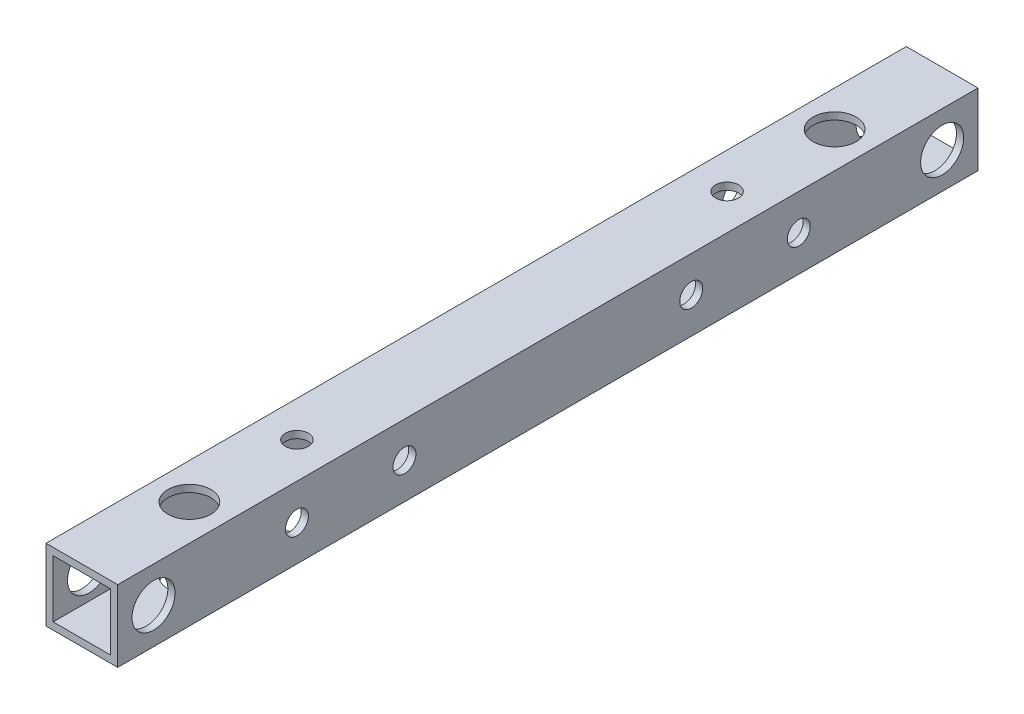
ISO-10303-21;
HEADER;
FILE_DESCRIPTION(('STEP AP214'),'2;1');
FILE_NAME('part.step','',(''),(''),'','','');
FILE_SCHEMA(('AUTOMOTIVE_DESIGN { 1 0 10303 214 1 1 1 1 }'));
ENDSEC;
DATA;
#1=APPLICATION_CONTEXT('core data for automotive mechanical design processes');
#2=APPLICATION_PROTOCOL_DEFINITION('international standard','automotive_design',2000,#1);
#3=PRODUCT_CONTEXT('',#1,'mechanical');
#4=PRODUCT('Part','Part','',(#3));
#5=PRODUCT_RELATED_PRODUCT_CATEGORY('part','',(#4));
#6=PRODUCT_DEFINITION_FORMATION('','',#4);
#7=PRODUCT_DEFINITION_CONTEXT('part definition',#1,'design');
#8=PRODUCT_DEFINITION('design','',#6,#7);
#9=PRODUCT_DEFINITION_SHAPE('','',#8);
#10=(LENGTH_UNIT() NAMED_UNIT(*) SI_UNIT(.MILLI.,.METRE.));
#11=(NAMED_UNIT(*) PLANE_ANGLE_UNIT() SI_UNIT($,.RADIAN.));
#12=(NAMED_UNIT(*) SI_UNIT($,.STERADIAN.) SOLID_ANGLE_UNIT());
#13=UNCERTAINTY_MEASURE_WITH_UNIT(LENGTH_MEASURE(1.E-05),#10,'distance_accuracy_value','');
#14=(GEOMETRIC_REPRESENTATION_CONTEXT(3) GLOBAL_UNCERTAINTY_ASSIGNED_CONTEXT((#13)) GLOBAL_UNIT_ASSIGNED_CONTEXT((#10,
#11,#12)) REPRESENTATION_CONTEXT('',''));
#15=CARTESIAN_POINT('',(0.,0.,0.));
#16=DIRECTION('',(0.,0.,1.));
#17=DIRECTION('',(1.,0.,0.));
#18=AXIS2_PLACEMENT_3D('',#15,#16,#17);
#19=CARTESIAN_POINT('',(0.,0.,120.));
#20=DIRECTION('',(0.,0.,-1.));
#21=DIRECTION('',(-1.,0.,0.));
#22=AXIS2_PLACEMENT_3D('',#19,#20,#21);
#23=PLANE('',#22);
#24=DIRECTION('',(0.,1.,0.));
#25=VECTOR('',#24,1.);
#26=CARTESIAN_POINT('',(5.,-5.,120.));
#27=LINE('',#26,#25);
#28=CARTESIAN_POINT('',(5.,-5.,120.));
#29=VERTEX_POINT('',#28);
#30=CARTESIAN_POINT('',(5.,5.,120.));
#31=VERTEX_POINT('',#30);
#32=EDGE_CURVE('E140',#29,#31,#27,.T.);
#33=ORIENTED_EDGE('',*,*,#32,.T.);
#34=DIRECTION('',(-1.,0.,0.));
#35=VECTOR('',#34,1.);
#36=CARTESIAN_POINT('',(-5.,5.,120.));
#37=LINE('',#36,#35);
#38=CARTESIAN_POINT('',(-5.,5.,120.));
#39=VERTEX_POINT('',#38);
#40=EDGE_CURVE('E143',#31,#39,#37,.T.);
#41=ORIENTED_EDGE('',*,*,#40,.T.);
#42=DIRECTION('',(0.,-1.,0.));
#43=VECTOR('',#42,1.);
#44=CARTESIAN_POINT('',(-5.,-5.,120.));
#45=LINE('',#44,#43);
#46=CARTESIAN_POINT('',(-5.,-5.,120.));
#47=VERTEX_POINT('',#46);
#48=EDGE_CURVE('E146',#39,#47,#45,.T.);
#49=ORIENTED_EDGE('',*,*,#48,.T.);
#50=DIRECTION('',(1.,0.,0.));
#51=VECTOR('',#50,1.);
#52=CARTESIAN_POINT('',(-5.,-5.,120.));
#53=LINE('',#52,#51);
#54=EDGE_CURVE('E148',#47,#29,#53,.T.);
#55=ORIENTED_EDGE('',*,*,#54,.T.);
#56=EDGE_LOOP('',(#33,#41,#49,#55));
#57=FACE_BOUND('',#56,.T.);
#58=DIRECTION('',(0.,-1.,0.));
#59=VECTOR('',#58,1.);
#60=CARTESIAN_POINT('',(-4.,-4.,120.));
#61=LINE('',#60,#59);
#62=CARTESIAN_POINT('',(-4.,4.,120.));
#63=VERTEX_POINT('',#62);
#64=CARTESIAN_POINT('',(-4.,-4.,120.));
#65=VERTEX_POINT('',#64);
#66=EDGE_CURVE('E102',#63,#65,#61,.T.);
#67=ORIENTED_EDGE('',*,*,#66,.F.);
#68=DIRECTION('',(-1.,0.,0.));
#69=VECTOR('',#68,1.);
#70=CARTESIAN_POINT('',(4.,4.,120.));
#71=LINE('',#70,#69);
#72=CARTESIAN_POINT('',(4.,4.,120.));
#73=VERTEX_POINT('',#72);
#74=EDGE_CURVE('E124',#73,#63,#71,.T.);
#75=ORIENTED_EDGE('',*,*,#74,.F.);
#76=DIRECTION('',(0.,1.,0.));
#77=VECTOR('',#76,1.);
#78=CARTESIAN_POINT('',(4.,-4.,120.));
#79=LINE('',#78,#77);
#80=CARTESIAN_POINT('',(4.,-4.,120.));
#81=VERTEX_POINT('',#80);
#82=EDGE_CURVE('E122',#81,#73,#79,.T.);
#83=ORIENTED_EDGE('',*,*,#82,.F.);
#84=DIRECTION('',(1.,0.,0.));
#85=VECTOR('',#84,1.);
#86=CARTESIAN_POINT('',(4.,-4.,120.));
#87=LINE('',#86,#85);
#88=EDGE_CURVE('E110',#65,#81,#87,.T.);
#89=ORIENTED_EDGE('',*,*,#88,.F.);
#90=EDGE_LOOP('',(#67,#75,#83,#89));
#91=FACE_BOUND('',#90,.T.);
#92=ADVANCED_FACE('F35',(#57,#91),#23,.F.);
#93=CARTESIAN_POINT('',(0.,0.,0.));
#94=DIRECTION('',(0.,0.,-1.));
#95=DIRECTION('',(-1.,0.,0.));
#96=AXIS2_PLACEMENT_3D('',#93,#94,#95);
#97=PLANE('',#96);
#98=DIRECTION('',(0.,1.,0.));
#99=VECTOR('',#98,1.);
#100=CARTESIAN_POINT('',(5.,-5.,0.));
#101=LINE('',#100,#99);
#102=CARTESIAN_POINT('',(5.,-5.,0.));
#103=VERTEX_POINT('',#102);
#104=CARTESIAN_POINT('',(5.,5.,0.));
#105=VERTEX_POINT('',#104);
#106=EDGE_CURVE('E118',#103,#105,#101,.T.);
#107=ORIENTED_EDGE('',*,*,#106,.F.);
#108=DIRECTION('',(1.,0.,0.));
#109=VECTOR('',#108,1.);
#110=CARTESIAN_POINT('',(-5.,-5.,0.));
#111=LINE('',#110,#109);
#112=CARTESIAN_POINT('',(-5.,-5.,0.));
#113=VERTEX_POINT('',#112);
#114=EDGE_CURVE('E144',#113,#103,#111,.T.);
#115=ORIENTED_EDGE('',*,*,#114,.F.);
#116=DIRECTION('',(0.,-1.,0.));
#117=VECTOR('',#116,1.);
#118=CARTESIAN_POINT('',(-5.,-5.,0.));
#119=LINE('',#118,#117);
#120=CARTESIAN_POINT('',(-5.,5.,0.));
#121=VERTEX_POINT('',#120);
#122=EDGE_CURVE('E155',#121,#113,#119,.T.);
#123=ORIENTED_EDGE('',*,*,#122,.F.);
#124=DIRECTION('',(-1.,0.,0.));
#125=VECTOR('',#124,1.);
#126=CARTESIAN_POINT('',(-5.,5.,0.));
#127=LINE('',#126,#125);
#128=EDGE_CURVE('E153',#105,#121,#127,.T.);
#129=ORIENTED_EDGE('',*,*,#128,.F.);
#130=EDGE_LOOP('',(#107,#115,#123,#129));
#131=FACE_BOUND('',#130,.T.);
#132=DIRECTION('',(-1.,0.,0.));
#133=VECTOR('',#132,1.);
#134=CARTESIAN_POINT('',(4.,4.,0.));
#135=LINE('',#134,#133);
#136=CARTESIAN_POINT('',(4.,4.,0.));
#137=VERTEX_POINT('',#136);
#138=CARTESIAN_POINT('',(-4.,4.,0.));
#139=VERTEX_POINT('',#138);
#140=EDGE_CURVE('E111',#137,#139,#135,.T.);
#141=ORIENTED_EDGE('',*,*,#140,.T.);
#142=DIRECTION('',(0.,-1.,0.));
#143=VECTOR('',#142,1.);
#144=CARTESIAN_POINT('',(-4.,-4.,0.));
#145=LINE('',#144,#143);
#146=CARTESIAN_POINT('',(-4.,-4.,0.));
#147=VERTEX_POINT('',#146);
#148=EDGE_CURVE('E60',#139,#147,#145,.T.);
#149=ORIENTED_EDGE('',*,*,#148,.T.);
#150=DIRECTION('',(1.,0.,0.));
#151=VECTOR('',#150,1.);
#152=CARTESIAN_POINT('',(4.,-4.,0.));
#153=LINE('',#152,#151);
#154=CARTESIAN_POINT('',(4.,-4.,0.));
#155=VERTEX_POINT('',#154);
#156=EDGE_CURVE('E117',#147,#155,#153,.T.);
#157=ORIENTED_EDGE('',*,*,#156,.T.);
#158=DIRECTION('',(0.,1.,0.));
#159=VECTOR('',#158,1.);
#160=CARTESIAN_POINT('',(4.,-4.,0.));
#161=LINE('',#160,#159);
#162=EDGE_CURVE('E132',#155,#137,#161,.T.);
#163=ORIENTED_EDGE('',*,*,#162,.T.);
#164=EDGE_LOOP('',(#141,#149,#157,#163));
#165=FACE_BOUND('',#164,.T.);
#166=ADVANCED_FACE('F318',(#131,#165),#97,.T.);
#167=CARTESIAN_POINT('',(5.,-5.,120.));
#168=DIRECTION('',(-1.,0.,0.));
#169=DIRECTION('',(0.,0.,1.));
#170=AXIS2_PLACEMENT_3D('',#167,#168,#169);
#171=PLANE('',#170);
#172=CARTESIAN_POINT('',(5.,0.,80.));
#173=DIRECTION('',(-1.,0.,0.));
#174=DIRECTION('',(0.,0.,1.));
#175=AXIS2_PLACEMENT_3D('',#172,#173,#174);
#176=CIRCLE('',#175,1.60000000000001);
#177=CARTESIAN_POINT('',(5.,0.,81.6));
#178=VERTEX_POINT('',#177);
#179=EDGE_CURVE('E209',#178,#178,#176,.T.);
#180=ORIENTED_EDGE('',*,*,#179,.T.);
#181=EDGE_LOOP('',(#180));
#182=FACE_BOUND('',#181,.T.);
#183=CARTESIAN_POINT('',(5.,0.,40.));
#184=DIRECTION('',(-1.,0.,0.));
#185=DIRECTION('',(0.,0.,1.));
#186=AXIS2_PLACEMENT_3D('',#183,#184,#185);
#187=CIRCLE('',#186,1.6);
#188=CARTESIAN_POINT('',(5.,0.,41.6));
#189=VERTEX_POINT('',#188);
#190=EDGE_CURVE('E220',#189,#189,#187,.T.);
#191=ORIENTED_EDGE('',*,*,#190,.T.);
#192=EDGE_LOOP('',(#191));
#193=FACE_BOUND('',#192,.T.);
#194=CARTESIAN_POINT('',(5.,0.,25.));
#195=DIRECTION('',(-1.,0.,0.));
#196=DIRECTION('',(0.,0.,1.));
#197=AXIS2_PLACEMENT_3D('',#194,#195,#196);
#198=CIRCLE('',#197,1.6);
#199=CARTESIAN_POINT('',(5.,0.,26.6));
#200=VERTEX_POINT('',#199);
#201=EDGE_CURVE('E194',#200,#200,#198,.T.);
#202=ORIENTED_EDGE('',*,*,#201,.T.);
#203=EDGE_LOOP('',(#202));
#204=FACE_BOUND('',#203,.T.);
#205=CARTESIAN_POINT('',(5.,0.,95.));
#206=DIRECTION('',(-1.,0.,0.));
#207=DIRECTION('',(0.,0.,1.));
#208=AXIS2_PLACEMENT_3D('',#205,#206,#207);
#209=CIRCLE('',#208,1.60000000000001);
#210=CARTESIAN_POINT('',(5.,0.,96.6));
#211=VERTEX_POINT('',#210);
#212=EDGE_CURVE('E241',#211,#211,#209,.T.);
#213=ORIENTED_EDGE('',*,*,#212,.T.);
#214=EDGE_LOOP('',(#213));
#215=FACE_BOUND('',#214,.T.);
#216=CARTESIAN_POINT('',(5.,0.,5.));
#217=DIRECTION('',(-1.,0.,0.));
#218=DIRECTION('',(0.,0.,1.));
#219=AXIS2_PLACEMENT_3D('',#216,#217,#218);
#220=CIRCLE('',#219,3.);
#221=CARTESIAN_POINT('',(5.,0.,8.));
#222=VERTEX_POINT('',#221);
#223=EDGE_CURVE('E169',#222,#222,#220,.T.);
#224=ORIENTED_EDGE('',*,*,#223,.T.);
#225=EDGE_LOOP('',(#224));
#226=FACE_BOUND('',#225,.T.);
#227=CARTESIAN_POINT('',(5.,0.,115.));
#228=DIRECTION('',(-1.,0.,0.));
#229=DIRECTION('',(0.,0.,1.));
#230=AXIS2_PLACEMENT_3D('',#227,#228,#229);
#231=CIRCLE('',#230,3.00000000000001);
#232=CARTESIAN_POINT('',(5.,0.,118.));
#233=VERTEX_POINT('',#232);
#234=EDGE_CURVE('E275',#233,#233,#231,.T.);
#235=ORIENTED_EDGE('',*,*,#234,.T.);
#236=EDGE_LOOP('',(#235));
#237=FACE_BOUND('',#236,.T.);
#238=ORIENTED_EDGE('',*,*,#106,.T.);
#239=DIRECTION('',(0.,0.,-1.));
#240=VECTOR('',#239,1.);
#241=CARTESIAN_POINT('',(5.,5.,120.));
#242=LINE('',#241,#240);
#243=EDGE_CURVE('E11',#31,#105,#242,.T.);
#244=ORIENTED_EDGE('',*,*,#243,.F.);
#245=ORIENTED_EDGE('',*,*,#32,.F.);
#246=DIRECTION('',(0.,0.,-1.));
#247=VECTOR('',#246,1.);
#248=CARTESIAN_POINT('',(5.,-5.,120.));
#249=LINE('',#248,#247);
#250=EDGE_CURVE('E150',#29,#103,#249,.T.);
#251=ORIENTED_EDGE('',*,*,#250,.T.);
#252=EDGE_LOOP('',(#238,#244,#245,#251));
#253=FACE_BOUND('',#252,.T.);
#254=ADVANCED_FACE('F37',(#182,#193,#204,#215,#226,#237,#253),#171,.F.);
#255=CARTESIAN_POINT('',(-5.,5.,120.));
#256=DIRECTION('',(0.,-1.,0.));
#257=DIRECTION('',(0.,0.,-1.));
#258=AXIS2_PLACEMENT_3D('',#255,#256,#257);
#259=PLANE('',#258);
#260=CARTESIAN_POINT('',(0.,5.,30.));
#261=DIRECTION('',(0.,1.,0.));
#262=DIRECTION('',(0.,0.,1.));
#263=AXIS2_PLACEMENT_3D('',#260,#261,#262);
#264=CIRCLE('',#263,1.6);
#265=CARTESIAN_POINT('',(0.,5.,31.6));
#266=VERTEX_POINT('',#265);
#267=EDGE_CURVE('E186',#266,#266,#264,.T.);
#268=ORIENTED_EDGE('',*,*,#267,.F.);
#269=EDGE_LOOP('',(#268));
#270=FACE_BOUND('',#269,.T.);
#271=CARTESIAN_POINT('',(0.,5.,90.));
#272=DIRECTION('',(0.,1.,0.));
#273=DIRECTION('',(0.,0.,1.));
#274=AXIS2_PLACEMENT_3D('',#271,#272,#273);
#275=CIRCLE('',#274,1.6);
#276=CARTESIAN_POINT('',(0.,5.,91.6));
#277=VERTEX_POINT('',#276);
#278=EDGE_CURVE('E250',#277,#277,#275,.T.);
#279=ORIENTED_EDGE('',*,*,#278,.F.);
#280=EDGE_LOOP('',(#279));
#281=FACE_BOUND('',#280,.T.);
#282=CARTESIAN_POINT('',(0.,5.,105.));
#283=DIRECTION('',(0.,1.,0.));
#284=DIRECTION('',(0.,0.,1.));
#285=AXIS2_PLACEMENT_3D('',#282,#283,#284);
#286=CIRCLE('',#285,3.);
#287=CARTESIAN_POINT('',(0.,5.,108.));
#288=VERTEX_POINT('',#287);
#289=EDGE_CURVE('E257',#288,#288,#286,.T.);
#290=ORIENTED_EDGE('',*,*,#289,.F.);
#291=EDGE_LOOP('',(#290));
#292=FACE_BOUND('',#291,.T.);
#293=CARTESIAN_POINT('',(0.,5.,15.));
#294=DIRECTION('',(0.,1.,0.));
#295=DIRECTION('',(0.,0.,1.));
#296=AXIS2_PLACEMENT_3D('',#293,#294,#295);
#297=CIRCLE('',#296,3.);
#298=CARTESIAN_POINT('',(0.,5.,18.));
#299=VERTEX_POINT('',#298);
#300=EDGE_CURVE('E189',#299,#299,#297,.T.);
#301=ORIENTED_EDGE('',*,*,#300,.F.);
#302=EDGE_LOOP('',(#301));
#303=FACE_BOUND('',#302,.T.);
#304=ORIENTED_EDGE('',*,*,#128,.T.);
#305=DIRECTION('',(0.,0.,-1.));
#306=VECTOR('',#305,1.);
#307=CARTESIAN_POINT('',(-5.,5.,120.));
#308=LINE('',#307,#306);
#309=EDGE_CURVE('E44',#39,#121,#308,.T.);
#310=ORIENTED_EDGE('',*,*,#309,.F.);
#311=ORIENTED_EDGE('',*,*,#40,.F.);
#312=ORIENTED_EDGE('',*,*,#243,.T.);
#313=EDGE_LOOP('',(#304,#310,#311,#312));
#314=FACE_BOUND('',#313,.T.);
#315=ADVANCED_FACE('F305',(#270,#281,#292,#303,#314),#259,.F.);
#316=CARTESIAN_POINT('',(-5.,-5.,120.));
#317=DIRECTION('',(1.,0.,0.));
#318=DIRECTION('',(0.,0.,-1.));
#319=AXIS2_PLACEMENT_3D('',#316,#317,#318);
#320=PLANE('',#319);
#321=CARTESIAN_POINT('',(-5.,0.,80.));
#322=DIRECTION('',(-1.,0.,0.));
#323=DIRECTION('',(0.,0.,1.));
#324=AXIS2_PLACEMENT_3D('',#321,#322,#323);
#325=CIRCLE('',#324,1.60000000000001);
#326=CARTESIAN_POINT('',(-5.,0.,81.6));
#327=VERTEX_POINT('',#326);
#328=EDGE_CURVE('E215',#327,#327,#325,.T.);
#329=ORIENTED_EDGE('',*,*,#328,.F.);
#330=EDGE_LOOP('',(#329));
#331=FACE_BOUND('',#330,.T.);
#332=CARTESIAN_POINT('',(-5.,0.,40.));
#333=DIRECTION('',(-1.,0.,0.));
#334=DIRECTION('',(0.,0.,1.));
#335=AXIS2_PLACEMENT_3D('',#332,#333,#334);
#336=CIRCLE('',#335,1.6);
#337=CARTESIAN_POINT('',(-5.,0.,41.6));
#338=VERTEX_POINT('',#337);
#339=EDGE_CURVE('E225',#338,#338,#336,.T.);
#340=ORIENTED_EDGE('',*,*,#339,.F.);
#341=EDGE_LOOP('',(#340));
#342=FACE_BOUND('',#341,.T.);
#343=CARTESIAN_POINT('',(-5.,0.,25.));
#344=DIRECTION('',(-1.,0.,0.));
#345=DIRECTION('',(0.,0.,1.));
#346=AXIS2_PLACEMENT_3D('',#343,#344,#345);
#347=CIRCLE('',#346,1.6);
#348=CARTESIAN_POINT('',(-5.,0.,26.6));
#349=VERTEX_POINT('',#348);
#350=EDGE_CURVE('E238',#349,#349,#347,.T.);
#351=ORIENTED_EDGE('',*,*,#350,.F.);
#352=EDGE_LOOP('',(#351));
#353=FACE_BOUND('',#352,.T.);
#354=CARTESIAN_POINT('',(-5.,0.,95.));
#355=DIRECTION('',(-1.,0.,0.));
#356=DIRECTION('',(0.,0.,1.));
#357=AXIS2_PLACEMENT_3D('',#354,#355,#356);
#358=CIRCLE('',#357,1.60000000000001);
#359=CARTESIAN_POINT('',(-5.,0.,96.6));
#360=VERTEX_POINT('',#359);
#361=EDGE_CURVE('E205',#360,#360,#358,.T.);
#362=ORIENTED_EDGE('',*,*,#361,.F.);
#363=EDGE_LOOP('',(#362));
#364=FACE_BOUND('',#363,.T.);
#365=CARTESIAN_POINT('',(-5.,0.,5.));
#366=DIRECTION('',(-1.,0.,0.));
#367=DIRECTION('',(0.,0.,1.));
#368=AXIS2_PLACEMENT_3D('',#365,#366,#367);
#369=CIRCLE('',#368,3.);
#370=CARTESIAN_POINT('',(-5.,0.,8.));
#371=VERTEX_POINT('',#370);
#372=EDGE_CURVE('E272',#371,#371,#369,.T.);
#373=ORIENTED_EDGE('',*,*,#372,.F.);
#374=EDGE_LOOP('',(#373));
#375=FACE_BOUND('',#374,.T.);
#376=CARTESIAN_POINT('',(-5.,0.,115.));
#377=DIRECTION('',(-1.,0.,0.));
#378=DIRECTION('',(0.,0.,1.));
#379=AXIS2_PLACEMENT_3D('',#376,#377,#378);
#380=CIRCLE('',#379,3.00000000000001);
#381=CARTESIAN_POINT('',(-5.,0.,118.));
#382=VERTEX_POINT('',#381);
#383=EDGE_CURVE('E269',#382,#382,#380,.T.);
#384=ORIENTED_EDGE('',*,*,#383,.F.);
#385=EDGE_LOOP('',(#384));
#386=FACE_BOUND('',#385,.T.);
#387=ORIENTED_EDGE('',*,*,#122,.T.);
#388=DIRECTION('',(0.,0.,-1.));
#389=VECTOR('',#388,1.);
#390=CARTESIAN_POINT('',(-5.,-5.,120.));
#391=LINE('',#390,#389);
#392=EDGE_CURVE('E160',#47,#113,#391,.T.);
#393=ORIENTED_EDGE('',*,*,#392,.F.);
#394=ORIENTED_EDGE('',*,*,#48,.F.);
#395=ORIENTED_EDGE('',*,*,#309,.T.);
#396=EDGE_LOOP('',(#387,#393,#394,#395));
#397=FACE_BOUND('',#396,.T.);
#398=ADVANCED_FACE('F302',(#331,#342,#353,#364,#375,#386,#397),#320,.F.);
#399=CARTESIAN_POINT('',(-5.,-5.,120.));
#400=DIRECTION('',(0.,1.,0.));
#401=DIRECTION('',(0.,0.,1.));
#402=AXIS2_PLACEMENT_3D('',#399,#400,#401);
#403=PLANE('',#402);
#404=CARTESIAN_POINT('',(0.,-5.,30.));
#405=DIRECTION('',(0.,-1.,0.));
#406=DIRECTION('',(0.,0.,-1.));
#407=AXIS2_PLACEMENT_3D('',#404,#405,#406);
#408=CIRCLE('',#407,3.);
#409=CARTESIAN_POINT('',(0.,-5.,27.));
#410=VERTEX_POINT('',#409);
#411=EDGE_CURVE('E203',#410,#410,#408,.T.);
#412=ORIENTED_EDGE('',*,*,#411,.F.);
#413=EDGE_LOOP('',(#412));
#414=FACE_BOUND('',#413,.T.);
#415=CARTESIAN_POINT('',(0.,-5.,90.));
#416=DIRECTION('',(0.,-1.,0.));
#417=DIRECTION('',(0.,0.,-1.));
#418=AXIS2_PLACEMENT_3D('',#415,#416,#417);
#419=CIRCLE('',#418,3.);
#420=CARTESIAN_POINT('',(0.,-5.,87.));
#421=VERTEX_POINT('',#420);
#422=EDGE_CURVE('E231',#421,#421,#419,.T.);
#423=ORIENTED_EDGE('',*,*,#422,.F.);
#424=EDGE_LOOP('',(#423));
#425=FACE_BOUND('',#424,.T.);
#426=CARTESIAN_POINT('',(0.,-5.,105.));
#427=DIRECTION('',(0.,1.,0.));
#428=DIRECTION('',(0.,0.,1.));
#429=AXIS2_PLACEMENT_3D('',#426,#427,#428);
#430=CIRCLE('',#429,3.);
#431=CARTESIAN_POINT('',(0.,-5.,108.));
#432=VERTEX_POINT('',#431);
#433=EDGE_CURVE('E177',#432,#432,#430,.T.);
#434=ORIENTED_EDGE('',*,*,#433,.T.);
#435=EDGE_LOOP('',(#434));
#436=FACE_BOUND('',#435,.T.);
#437=CARTESIAN_POINT('',(0.,-5.,15.));
#438=DIRECTION('',(0.,1.,0.));
#439=DIRECTION('',(0.,0.,1.));
#440=AXIS2_PLACEMENT_3D('',#437,#438,#439);
#441=CIRCLE('',#440,3.);
#442=CARTESIAN_POINT('',(0.,-5.,18.));
#443=VERTEX_POINT('',#442);
#444=EDGE_CURVE('E260',#443,#443,#441,.T.);
#445=ORIENTED_EDGE('',*,*,#444,.T.);
#446=EDGE_LOOP('',(#445));
#447=FACE_BOUND('',#446,.T.);
#448=ORIENTED_EDGE('',*,*,#114,.T.);
#449=ORIENTED_EDGE('',*,*,#250,.F.);
#450=ORIENTED_EDGE('',*,*,#54,.F.);
#451=ORIENTED_EDGE('',*,*,#392,.T.);
#452=EDGE_LOOP('',(#448,#449,#450,#451));
#453=FACE_BOUND('',#452,.T.);
#454=ADVANCED_FACE('F289',(#414,#425,#436,#447,#453),#403,.F.);
#455=CARTESIAN_POINT('',(-4.,-4.,120.));
#456=DIRECTION('',(1.,0.,0.));
#457=DIRECTION('',(0.,1.,0.));
#458=AXIS2_PLACEMENT_3D('',#455,#456,#457);
#459=PLANE('',#458);
#460=CARTESIAN_POINT('',(-4.,0.,80.));
#461=DIRECTION('',(1.,0.,0.));
#462=DIRECTION('',(0.,1.,0.));
#463=AXIS2_PLACEMENT_3D('',#460,#461,#462);
#464=CIRCLE('',#463,1.60000000000001);
#465=CARTESIAN_POINT('',(-4.,1.60000000000001,80.));
#466=VERTEX_POINT('',#465);
#467=EDGE_CURVE('E228',#466,#466,#464,.T.);
#468=ORIENTED_EDGE('',*,*,#467,.F.);
#469=EDGE_LOOP('',(#468));
#470=FACE_BOUND('',#469,.T.);
#471=CARTESIAN_POINT('',(-4.,0.,40.));
#472=DIRECTION('',(1.,0.,0.));
#473=DIRECTION('',(0.,1.,0.));
#474=AXIS2_PLACEMENT_3D('',#471,#472,#473);
#475=CIRCLE('',#474,1.6);
#476=CARTESIAN_POINT('',(-4.,1.6,40.));
#477=VERTEX_POINT('',#476);
#478=EDGE_CURVE('E208',#477,#477,#475,.T.);
#479=ORIENTED_EDGE('',*,*,#478,.F.);
#480=EDGE_LOOP('',(#479));
#481=FACE_BOUND('',#480,.T.);
#482=CARTESIAN_POINT('',(-4.,0.,25.));
#483=DIRECTION('',(1.,0.,0.));
#484=DIRECTION('',(0.,1.,0.));
#485=AXIS2_PLACEMENT_3D('',#482,#483,#484);
#486=CIRCLE('',#485,1.6);
#487=CARTESIAN_POINT('',(-4.,1.6,25.));
#488=VERTEX_POINT('',#487);
#489=EDGE_CURVE('E198',#488,#488,#486,.T.);
#490=ORIENTED_EDGE('',*,*,#489,.F.);
#491=EDGE_LOOP('',(#490));
#492=FACE_BOUND('',#491,.T.);
#493=CARTESIAN_POINT('',(-4.,0.,95.));
#494=DIRECTION('',(1.,0.,0.));
#495=DIRECTION('',(0.,1.,0.));
#496=AXIS2_PLACEMENT_3D('',#493,#494,#495);
#497=CIRCLE('',#496,1.60000000000001);
#498=CARTESIAN_POINT('',(-4.,1.60000000000001,95.));
#499=VERTEX_POINT('',#498);
#500=EDGE_CURVE('E193',#499,#499,#497,.T.);
#501=ORIENTED_EDGE('',*,*,#500,.F.);
#502=EDGE_LOOP('',(#501));
#503=FACE_BOUND('',#502,.T.);
#504=CARTESIAN_POINT('',(-4.,0.,5.));
#505=DIRECTION('',(1.,0.,0.));
#506=DIRECTION('',(0.,1.,0.));
#507=AXIS2_PLACEMENT_3D('',#504,#505,#506);
#508=CIRCLE('',#507,3.);
#509=CARTESIAN_POINT('',(-4.,3.,5.));
#510=VERTEX_POINT('',#509);
#511=EDGE_CURVE('E130',#510,#510,#508,.T.);
#512=ORIENTED_EDGE('',*,*,#511,.F.);
#513=EDGE_LOOP('',(#512));
#514=FACE_BOUND('',#513,.T.);
#515=CARTESIAN_POINT('',(-4.,0.,115.));
#516=DIRECTION('',(1.,0.,0.));
#517=DIRECTION('',(0.,1.,0.));
#518=AXIS2_PLACEMENT_3D('',#515,#516,#517);
#519=CIRCLE('',#518,3.00000000000001);
#520=CARTESIAN_POINT('',(-4.,3.00000000000001,115.));
#521=VERTEX_POINT('',#520);
#522=EDGE_CURVE('E168',#521,#521,#519,.T.);
#523=ORIENTED_EDGE('',*,*,#522,.F.);
#524=EDGE_LOOP('',(#523));
#525=FACE_BOUND('',#524,.T.);
#526=ORIENTED_EDGE('',*,*,#148,.F.);
#527=DIRECTION('',(0.,0.,-1.));
#528=VECTOR('',#527,1.);
#529=CARTESIAN_POINT('',(-4.,4.,120.));
#530=LINE('',#529,#528);
#531=EDGE_CURVE('E106',#63,#139,#530,.T.);
#532=ORIENTED_EDGE('',*,*,#531,.F.);
#533=ORIENTED_EDGE('',*,*,#66,.T.);
#534=DIRECTION('',(0.,0.,-1.));
#535=VECTOR('',#534,1.);
#536=CARTESIAN_POINT('',(-4.,-4.,120.));
#537=LINE('',#536,#535);
#538=EDGE_CURVE('E105',#65,#147,#537,.T.);
#539=ORIENTED_EDGE('',*,*,#538,.T.);
#540=EDGE_LOOP('',(#526,#532,#533,#539));
#541=FACE_BOUND('',#540,.T.);
#542=ADVANCED_FACE('F104',(#470,#481,#492,#503,#514,#525,#541),#459,.T.);
#543=CARTESIAN_POINT('',(4.,-4.,120.));
#544=DIRECTION('',(0.,1.,0.));
#545=DIRECTION('',(-1.,0.,0.));
#546=AXIS2_PLACEMENT_3D('',#543,#544,#545);
#547=PLANE('',#546);
#548=CARTESIAN_POINT('',(0.,-4.,30.));
#549=DIRECTION('',(0.,1.,0.));
#550=DIRECTION('',(-1.,0.,0.));
#551=AXIS2_PLACEMENT_3D('',#548,#549,#550);
#552=CIRCLE('',#551,3.);
#553=CARTESIAN_POINT('',(-3.,-4.,30.));
#554=VERTEX_POINT('',#553);
#555=EDGE_CURVE('E202',#554,#554,#552,.T.);
#556=ORIENTED_EDGE('',*,*,#555,.F.);
#557=EDGE_LOOP('',(#556));
#558=FACE_BOUND('',#557,.T.);
#559=CARTESIAN_POINT('',(0.,-4.,90.));
#560=DIRECTION('',(0.,1.,0.));
#561=DIRECTION('',(-1.,0.,0.));
#562=AXIS2_PLACEMENT_3D('',#559,#560,#561);
#563=CIRCLE('',#562,3.);
#564=CARTESIAN_POINT('',(-3.,-4.,90.));
#565=VERTEX_POINT('',#564);
#566=EDGE_CURVE('E199',#565,#565,#563,.T.);
#567=ORIENTED_EDGE('',*,*,#566,.F.);
#568=EDGE_LOOP('',(#567));
#569=FACE_BOUND('',#568,.T.);
#570=CARTESIAN_POINT('',(0.,-4.,105.));
#571=DIRECTION('',(0.,1.,0.));
#572=DIRECTION('',(-1.,0.,0.));
#573=AXIS2_PLACEMENT_3D('',#570,#571,#572);
#574=CIRCLE('',#573,3.);
#575=CARTESIAN_POINT('',(-3.,-4.,105.));
#576=VERTEX_POINT('',#575);
#577=EDGE_CURVE('E181',#576,#576,#574,.T.);
#578=ORIENTED_EDGE('',*,*,#577,.F.);
#579=EDGE_LOOP('',(#578));
#580=FACE_BOUND('',#579,.T.);
#581=CARTESIAN_POINT('',(0.,-4.,15.));
#582=DIRECTION('',(0.,1.,0.));
#583=DIRECTION('',(-1.,0.,0.));
#584=AXIS2_PLACEMENT_3D('',#581,#582,#583);
#585=CIRCLE('',#584,3.);
#586=CARTESIAN_POINT('',(-3.,-4.,15.));
#587=VERTEX_POINT('',#586);
#588=EDGE_CURVE('E176',#587,#587,#585,.T.);
#589=ORIENTED_EDGE('',*,*,#588,.F.);
#590=EDGE_LOOP('',(#589));
#591=FACE_BOUND('',#590,.T.);
#592=ORIENTED_EDGE('',*,*,#156,.F.);
#593=ORIENTED_EDGE('',*,*,#538,.F.);
#594=ORIENTED_EDGE('',*,*,#88,.T.);
#595=DIRECTION('',(0.,0.,-1.));
#596=VECTOR('',#595,1.);
#597=CARTESIAN_POINT('',(4.,-4.,120.));
#598=LINE('',#597,#596);
#599=EDGE_CURVE('E119',#81,#155,#598,.T.);
#600=ORIENTED_EDGE('',*,*,#599,.T.);
#601=EDGE_LOOP('',(#592,#593,#594,#600));
#602=FACE_BOUND('',#601,.T.);
#603=ADVANCED_FACE('F114',(#558,#569,#580,#591,#602),#547,.T.);
#604=CARTESIAN_POINT('',(4.,-4.,120.));
#605=DIRECTION('',(-1.,0.,0.));
#606=DIRECTION('',(0.,0.,1.));
#607=AXIS2_PLACEMENT_3D('',#604,#605,#606);
#608=PLANE('',#607);
#609=CARTESIAN_POINT('',(4.,0.,80.));
#610=DIRECTION('',(-1.,0.,0.));
#611=DIRECTION('',(0.,0.,1.));
#612=AXIS2_PLACEMENT_3D('',#609,#610,#611);
#613=CIRCLE('',#612,1.60000000000001);
#614=CARTESIAN_POINT('',(4.,0.,81.6));
#615=VERTEX_POINT('',#614);
#616=EDGE_CURVE('E39',#615,#615,#613,.T.);
#617=ORIENTED_EDGE('',*,*,#616,.F.);
#618=EDGE_LOOP('',(#617));
#619=FACE_BOUND('',#618,.T.);
#620=CARTESIAN_POINT('',(4.,0.,40.));
#621=DIRECTION('',(-1.,0.,0.));
#622=DIRECTION('',(0.,0.,1.));
#623=AXIS2_PLACEMENT_3D('',#620,#621,#622);
#624=CIRCLE('',#623,1.6);
#625=CARTESIAN_POINT('',(4.,0.,41.6));
#626=VERTEX_POINT('',#625);
#627=EDGE_CURVE('E206',#626,#626,#624,.T.);
#628=ORIENTED_EDGE('',*,*,#627,.F.);
#629=EDGE_LOOP('',(#628));
#630=FACE_BOUND('',#629,.T.);
#631=CARTESIAN_POINT('',(4.,0.,25.));
#632=DIRECTION('',(-1.,0.,0.));
#633=DIRECTION('',(0.,0.,1.));
#634=AXIS2_PLACEMENT_3D('',#631,#632,#633);
#635=CIRCLE('',#634,1.6);
#636=CARTESIAN_POINT('',(4.,0.,26.6));
#637=VERTEX_POINT('',#636);
#638=EDGE_CURVE('E195',#637,#637,#635,.T.);
#639=ORIENTED_EDGE('',*,*,#638,.F.);
#640=EDGE_LOOP('',(#639));
#641=FACE_BOUND('',#640,.T.);
#642=CARTESIAN_POINT('',(4.,0.,95.));
#643=DIRECTION('',(-1.,0.,0.));
#644=DIRECTION('',(0.,0.,1.));
#645=AXIS2_PLACEMENT_3D('',#642,#643,#644);
#646=CIRCLE('',#645,1.60000000000001);
#647=CARTESIAN_POINT('',(4.,0.,96.6));
#648=VERTEX_POINT('',#647);
#649=EDGE_CURVE('E190',#648,#648,#646,.T.);
#650=ORIENTED_EDGE('',*,*,#649,.F.);
#651=EDGE_LOOP('',(#650));
#652=FACE_BOUND('',#651,.T.);
#653=CARTESIAN_POINT('',(4.,0.,5.));
#654=DIRECTION('',(-1.,0.,0.));
#655=DIRECTION('',(0.,0.,1.));
#656=AXIS2_PLACEMENT_3D('',#653,#654,#655);
#657=CIRCLE('',#656,3.);
#658=CARTESIAN_POINT('',(4.,0.,8.));
#659=VERTEX_POINT('',#658);
#660=EDGE_CURVE('E170',#659,#659,#657,.T.);
#661=ORIENTED_EDGE('',*,*,#660,.F.);
#662=EDGE_LOOP('',(#661));
#663=FACE_BOUND('',#662,.T.);
#664=CARTESIAN_POINT('',(4.,0.,115.));
#665=DIRECTION('',(-1.,0.,0.));
#666=DIRECTION('',(0.,0.,1.));
#667=AXIS2_PLACEMENT_3D('',#664,#665,#666);
#668=CIRCLE('',#667,3.00000000000001);
#669=CARTESIAN_POINT('',(4.,0.,118.));
#670=VERTEX_POINT('',#669);
#671=EDGE_CURVE('E165',#670,#670,#668,.T.);
#672=ORIENTED_EDGE('',*,*,#671,.F.);
#673=EDGE_LOOP('',(#672));
#674=FACE_BOUND('',#673,.T.);
#675=ORIENTED_EDGE('',*,*,#162,.F.);
#676=ORIENTED_EDGE('',*,*,#599,.F.);
#677=ORIENTED_EDGE('',*,*,#82,.T.);
#678=DIRECTION('',(0.,0.,-1.));
#679=VECTOR('',#678,1.);
#680=CARTESIAN_POINT('',(4.,4.,120.));
#681=LINE('',#680,#679);
#682=EDGE_CURVE('E52',#73,#137,#681,.T.);
#683=ORIENTED_EDGE('',*,*,#682,.T.);
#684=EDGE_LOOP('',(#675,#676,#677,#683));
#685=FACE_BOUND('',#684,.T.);
#686=ADVANCED_FACE('F383',(#619,#630,#641,#652,#663,#674,#685),#608,.T.);
#687=CARTESIAN_POINT('',(4.,4.,120.));
#688=DIRECTION('',(0.,-1.,0.));
#689=DIRECTION('',(1.,0.,0.));
#690=AXIS2_PLACEMENT_3D('',#687,#688,#689);
#691=PLANE('',#690);
#692=CARTESIAN_POINT('',(0.,4.,30.));
#693=DIRECTION('',(0.,-1.,0.));
#694=DIRECTION('',(1.,0.,0.));
#695=AXIS2_PLACEMENT_3D('',#692,#693,#694);
#696=CIRCLE('',#695,1.6);
#697=CARTESIAN_POINT('',(1.6,4.,30.));
#698=VERTEX_POINT('',#697);
#699=EDGE_CURVE('E185',#698,#698,#696,.T.);
#700=ORIENTED_EDGE('',*,*,#699,.F.);
#701=EDGE_LOOP('',(#700));
#702=FACE_BOUND('',#701,.T.);
#703=CARTESIAN_POINT('',(0.,4.,90.));
#704=DIRECTION('',(0.,-1.,0.));
#705=DIRECTION('',(1.,0.,0.));
#706=AXIS2_PLACEMENT_3D('',#703,#704,#705);
#707=CIRCLE('',#706,1.6);
#708=CARTESIAN_POINT('',(1.6,4.,90.));
#709=VERTEX_POINT('',#708);
#710=EDGE_CURVE('E182',#709,#709,#707,.T.);
#711=ORIENTED_EDGE('',*,*,#710,.F.);
#712=EDGE_LOOP('',(#711));
#713=FACE_BOUND('',#712,.T.);
#714=CARTESIAN_POINT('',(0.,4.,105.));
#715=DIRECTION('',(0.,-1.,0.));
#716=DIRECTION('',(1.,0.,0.));
#717=AXIS2_PLACEMENT_3D('',#714,#715,#716);
#718=CIRCLE('',#717,3.);
#719=CARTESIAN_POINT('',(3.,4.,105.));
#720=VERTEX_POINT('',#719);
#721=EDGE_CURVE('E178',#720,#720,#718,.T.);
#722=ORIENTED_EDGE('',*,*,#721,.F.);
#723=EDGE_LOOP('',(#722));
#724=FACE_BOUND('',#723,.T.);
#725=CARTESIAN_POINT('',(0.,4.,15.));
#726=DIRECTION('',(0.,-1.,0.));
#727=DIRECTION('',(1.,0.,0.));
#728=AXIS2_PLACEMENT_3D('',#725,#726,#727);
#729=CIRCLE('',#728,3.);
#730=CARTESIAN_POINT('',(3.,4.,15.));
#731=VERTEX_POINT('',#730);
#732=EDGE_CURVE('E173',#731,#731,#729,.T.);
#733=ORIENTED_EDGE('',*,*,#732,.F.);
#734=EDGE_LOOP('',(#733));
#735=FACE_BOUND('',#734,.T.);
#736=ORIENTED_EDGE('',*,*,#140,.F.);
#737=ORIENTED_EDGE('',*,*,#682,.F.);
#738=ORIENTED_EDGE('',*,*,#74,.T.);
#739=ORIENTED_EDGE('',*,*,#531,.T.);
#740=EDGE_LOOP('',(#736,#737,#738,#739));
#741=FACE_BOUND('',#740,.T.);
#742=ADVANCED_FACE('F381',(#702,#713,#724,#735,#741),#691,.T.);
#743=CARTESIAN_POINT('',(5.,0.,115.));
#744=DIRECTION('',(-1.,0.,0.));
#745=DIRECTION('',(0.,0.,1.));
#746=AXIS2_PLACEMENT_3D('',#743,#744,#745);
#747=CYLINDRICAL_SURFACE('',#746,3.00000000000001);
#748=ORIENTED_EDGE('',*,*,#671,.T.);
#749=EDGE_LOOP('',(#748));
#750=FACE_BOUND('',#749,.T.);
#751=ORIENTED_EDGE('',*,*,#234,.F.);
#752=EDGE_LOOP('',(#751));
#753=FACE_BOUND('',#752,.T.);
#754=ADVANCED_FACE('F299',(#750,#753),#747,.F.);
#755=CARTESIAN_POINT('',(5.,0.,5.));
#756=DIRECTION('',(-1.,0.,0.));
#757=DIRECTION('',(0.,0.,1.));
#758=AXIS2_PLACEMENT_3D('',#755,#756,#757);
#759=CYLINDRICAL_SURFACE('',#758,3.);
#760=ORIENTED_EDGE('',*,*,#660,.T.);
#761=EDGE_LOOP('',(#760));
#762=FACE_BOUND('',#761,.T.);
#763=ORIENTED_EDGE('',*,*,#223,.F.);
#764=EDGE_LOOP('',(#763));
#765=FACE_BOUND('',#764,.T.);
#766=ADVANCED_FACE('F297',(#762,#765),#759,.F.);
#767=ORIENTED_EDGE('',*,*,#522,.T.);
#768=EDGE_LOOP('',(#767));
#769=FACE_BOUND('',#768,.T.);
#770=ORIENTED_EDGE('',*,*,#383,.T.);
#771=EDGE_LOOP('',(#770));
#772=FACE_BOUND('',#771,.T.);
#773=ADVANCED_FACE('F294',(#769,#772),#747,.F.);
#774=ORIENTED_EDGE('',*,*,#511,.T.);
#775=EDGE_LOOP('',(#774));
#776=FACE_BOUND('',#775,.T.);
#777=ORIENTED_EDGE('',*,*,#372,.T.);
#778=EDGE_LOOP('',(#777));
#779=FACE_BOUND('',#778,.T.);
#780=ADVANCED_FACE('F284',(#776,#779),#759,.F.);
#781=CARTESIAN_POINT('',(0.,-5.,15.));
#782=DIRECTION('',(0.,1.,0.));
#783=DIRECTION('',(0.,0.,1.));
#784=AXIS2_PLACEMENT_3D('',#781,#782,#783);
#785=CYLINDRICAL_SURFACE('',#784,3.);
#786=ORIENTED_EDGE('',*,*,#732,.T.);
#787=EDGE_LOOP('',(#786));
#788=FACE_BOUND('',#787,.T.);
#789=ORIENTED_EDGE('',*,*,#300,.T.);
#790=EDGE_LOOP('',(#789));
#791=FACE_BOUND('',#790,.T.);
#792=ADVANCED_FACE('F361',(#788,#791),#785,.F.);
#793=CARTESIAN_POINT('',(0.,-5.,105.));
#794=DIRECTION('',(0.,1.,0.));
#795=DIRECTION('',(0.,0.,1.));
#796=AXIS2_PLACEMENT_3D('',#793,#794,#795);
#797=CYLINDRICAL_SURFACE('',#796,3.);
#798=ORIENTED_EDGE('',*,*,#721,.T.);
#799=EDGE_LOOP('',(#798));
#800=FACE_BOUND('',#799,.T.);
#801=ORIENTED_EDGE('',*,*,#289,.T.);
#802=EDGE_LOOP('',(#801));
#803=FACE_BOUND('',#802,.T.);
#804=ADVANCED_FACE('F358',(#800,#803),#797,.F.);
#805=ORIENTED_EDGE('',*,*,#588,.T.);
#806=EDGE_LOOP('',(#805));
#807=FACE_BOUND('',#806,.T.);
#808=ORIENTED_EDGE('',*,*,#444,.F.);
#809=EDGE_LOOP('',(#808));
#810=FACE_BOUND('',#809,.T.);
#811=ADVANCED_FACE('F355',(#807,#810),#785,.F.);
#812=ORIENTED_EDGE('',*,*,#577,.T.);
#813=EDGE_LOOP('',(#812));
#814=FACE_BOUND('',#813,.T.);
#815=ORIENTED_EDGE('',*,*,#433,.F.);
#816=EDGE_LOOP('',(#815));
#817=FACE_BOUND('',#816,.T.);
#818=ADVANCED_FACE('F357',(#814,#817),#797,.F.);
#819=CARTESIAN_POINT('',(0.,-5.,90.));
#820=DIRECTION('',(0.,1.,0.));
#821=DIRECTION('',(0.,0.,1.));
#822=AXIS2_PLACEMENT_3D('',#819,#820,#821);
#823=CYLINDRICAL_SURFACE('',#822,1.6);
#824=ORIENTED_EDGE('',*,*,#710,.T.);
#825=EDGE_LOOP('',(#824));
#826=FACE_BOUND('',#825,.T.);
#827=ORIENTED_EDGE('',*,*,#278,.T.);
#828=EDGE_LOOP('',(#827));
#829=FACE_BOUND('',#828,.T.);
#830=ADVANCED_FACE('F366',(#826,#829),#823,.F.);
#831=CARTESIAN_POINT('',(0.,-5.,30.));
#832=DIRECTION('',(0.,1.,0.));
#833=DIRECTION('',(0.,0.,1.));
#834=AXIS2_PLACEMENT_3D('',#831,#832,#833);
#835=CYLINDRICAL_SURFACE('',#834,1.6);
#836=ORIENTED_EDGE('',*,*,#699,.T.);
#837=EDGE_LOOP('',(#836));
#838=FACE_BOUND('',#837,.T.);
#839=ORIENTED_EDGE('',*,*,#267,.T.);
#840=EDGE_LOOP('',(#839));
#841=FACE_BOUND('',#840,.T.);
#842=ADVANCED_FACE('F467',(#838,#841),#835,.F.);
#843=CARTESIAN_POINT('',(5.,0.,95.));
#844=DIRECTION('',(-1.,0.,0.));
#845=DIRECTION('',(0.,0.,1.));
#846=AXIS2_PLACEMENT_3D('',#843,#844,#845);
#847=CYLINDRICAL_SURFACE('',#846,1.60000000000001);
#848=ORIENTED_EDGE('',*,*,#649,.T.);
#849=EDGE_LOOP('',(#848));
#850=FACE_BOUND('',#849,.T.);
#851=ORIENTED_EDGE('',*,*,#212,.F.);
#852=EDGE_LOOP('',(#851));
#853=FACE_BOUND('',#852,.T.);
#854=ADVANCED_FACE('F477',(#850,#853),#847,.F.);
#855=CARTESIAN_POINT('',(5.,0.,25.));
#856=DIRECTION('',(-1.,0.,0.));
#857=DIRECTION('',(0.,0.,1.));
#858=AXIS2_PLACEMENT_3D('',#855,#856,#857);
#859=CYLINDRICAL_SURFACE('',#858,1.6);
#860=ORIENTED_EDGE('',*,*,#638,.T.);
#861=EDGE_LOOP('',(#860));
#862=FACE_BOUND('',#861,.T.);
#863=ORIENTED_EDGE('',*,*,#201,.F.);
#864=EDGE_LOOP('',(#863));
#865=FACE_BOUND('',#864,.T.);
#866=ADVANCED_FACE('F487',(#862,#865),#859,.F.);
#867=ORIENTED_EDGE('',*,*,#500,.T.);
#868=EDGE_LOOP('',(#867));
#869=FACE_BOUND('',#868,.T.);
#870=ORIENTED_EDGE('',*,*,#361,.T.);
#871=EDGE_LOOP('',(#870));
#872=FACE_BOUND('',#871,.T.);
#873=ADVANCED_FACE('F490',(#869,#872),#847,.F.);
#874=ORIENTED_EDGE('',*,*,#489,.T.);
#875=EDGE_LOOP('',(#874));
#876=FACE_BOUND('',#875,.T.);
#877=ORIENTED_EDGE('',*,*,#350,.T.);
#878=EDGE_LOOP('',(#877));
#879=FACE_BOUND('',#878,.T.);
#880=ADVANCED_FACE('F500',(#876,#879),#859,.F.);
#881=CARTESIAN_POINT('',(0.,-3.,90.));
#882=DIRECTION('',(0.,-1.,0.));
#883=DIRECTION('',(0.,0.,-1.));
#884=AXIS2_PLACEMENT_3D('',#881,#882,#883);
#885=CYLINDRICAL_SURFACE('',#884,3.);
#886=ORIENTED_EDGE('',*,*,#566,.T.);
#887=EDGE_LOOP('',(#886));
#888=FACE_BOUND('',#887,.T.);
#889=ORIENTED_EDGE('',*,*,#422,.T.);
#890=EDGE_LOOP('',(#889));
#891=FACE_BOUND('',#890,.T.);
#892=ADVANCED_FACE('F515',(#888,#891),#885,.F.);
#893=CARTESIAN_POINT('',(0.,-3.,30.));
#894=DIRECTION('',(0.,-1.,0.));
#895=DIRECTION('',(0.,0.,-1.));
#896=AXIS2_PLACEMENT_3D('',#893,#894,#895);
#897=CYLINDRICAL_SURFACE('',#896,3.);
#898=ORIENTED_EDGE('',*,*,#555,.T.);
#899=EDGE_LOOP('',(#898));
#900=FACE_BOUND('',#899,.T.);
#901=ORIENTED_EDGE('',*,*,#411,.T.);
#902=EDGE_LOOP('',(#901));
#903=FACE_BOUND('',#902,.T.);
#904=ADVANCED_FACE('F536',(#900,#903),#897,.F.);
#905=CARTESIAN_POINT('',(5.,0.,40.));
#906=DIRECTION('',(-1.,0.,0.));
#907=DIRECTION('',(0.,0.,1.));
#908=AXIS2_PLACEMENT_3D('',#905,#906,#907);
#909=CYLINDRICAL_SURFACE('',#908,1.6);
#910=ORIENTED_EDGE('',*,*,#627,.T.);
#911=EDGE_LOOP('',(#910));
#912=FACE_BOUND('',#911,.T.);
#913=ORIENTED_EDGE('',*,*,#190,.F.);
#914=EDGE_LOOP('',(#913));
#915=FACE_BOUND('',#914,.T.);
#916=ADVANCED_FACE('F545',(#912,#915),#909,.F.);
#917=CARTESIAN_POINT('',(5.,0.,80.));
#918=DIRECTION('',(-1.,0.,0.));
#919=DIRECTION('',(0.,0.,1.));
#920=AXIS2_PLACEMENT_3D('',#917,#918,#919);
#921=CYLINDRICAL_SURFACE('',#920,1.60000000000001);
#922=ORIENTED_EDGE('',*,*,#616,.T.);
#923=EDGE_LOOP('',(#922));
#924=FACE_BOUND('',#923,.T.);
#925=ORIENTED_EDGE('',*,*,#179,.F.);
#926=EDGE_LOOP('',(#925));
#927=FACE_BOUND('',#926,.T.);
#928=ADVANCED_FACE('F586',(#924,#927),#921,.F.);
#929=ORIENTED_EDGE('',*,*,#478,.T.);
#930=EDGE_LOOP('',(#929));
#931=FACE_BOUND('',#930,.T.);
#932=ORIENTED_EDGE('',*,*,#339,.T.);
#933=EDGE_LOOP('',(#932));
#934=FACE_BOUND('',#933,.T.);
#935=ADVANCED_FACE('F588',(#931,#934),#909,.F.);
#936=ORIENTED_EDGE('',*,*,#467,.T.);
#937=EDGE_LOOP('',(#936));
#938=FACE_BOUND('',#937,.T.);
#939=ORIENTED_EDGE('',*,*,#328,.T.);
#940=EDGE_LOOP('',(#939));
#941=FACE_BOUND('',#940,.T.);
#942=ADVANCED_FACE('F595',(#938,#941),#921,.F.);
#943=CLOSED_SHELL('',(#92,#166,#254,#315,#398,#454,#542,#603,#686,#742,#754,#766,#773,#780,#792,
#804,#811,#818,#830,#842,#854,#866,#873,#880,#892,#904,#916,#928,#935,#942));
#944=MANIFOLD_SOLID_BREP('B2',#943);
#945=ADVANCED_BREP_SHAPE_REPRESENTATION('',(#18,#944),#14);
#946=SHAPE_DEFINITION_REPRESENTATION(#9,#945);
ENDSEC;
END-ISO-10303-21;
